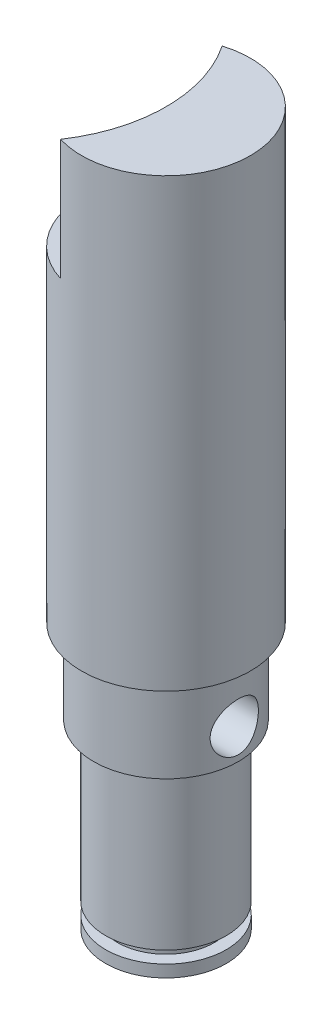
ISO-10303-21;
HEADER;
FILE_DESCRIPTION(('STEP AP214'),'2;1');
FILE_NAME('part.step','',(''),(''),'','','');
FILE_SCHEMA(('AUTOMOTIVE_DESIGN { 1 0 10303 214 1 1 1 1 }'));
ENDSEC;
DATA;
#1=APPLICATION_CONTEXT('core data for automotive mechanical design processes');
#2=APPLICATION_PROTOCOL_DEFINITION('international standard','automotive_design',2000,#1);
#3=PRODUCT_CONTEXT('',#1,'mechanical');
#4=PRODUCT('Part','Part','',(#3));
#5=PRODUCT_RELATED_PRODUCT_CATEGORY('part','',(#4));
#6=PRODUCT_DEFINITION_FORMATION('','',#4);
#7=PRODUCT_DEFINITION_CONTEXT('part definition',#1,'design');
#8=PRODUCT_DEFINITION('design','',#6,#7);
#9=PRODUCT_DEFINITION_SHAPE('','',#8);
#10=(LENGTH_UNIT() NAMED_UNIT(*) SI_UNIT(.MILLI.,.METRE.));
#11=(NAMED_UNIT(*) PLANE_ANGLE_UNIT() SI_UNIT($,.RADIAN.));
#12=(NAMED_UNIT(*) SI_UNIT($,.STERADIAN.) SOLID_ANGLE_UNIT());
#13=UNCERTAINTY_MEASURE_WITH_UNIT(LENGTH_MEASURE(1.E-05),#10,'distance_accuracy_value','');
#14=(GEOMETRIC_REPRESENTATION_CONTEXT(3) GLOBAL_UNCERTAINTY_ASSIGNED_CONTEXT((#13)) GLOBAL_UNIT_ASSIGNED_CONTEXT((#10,
#11,#12)) REPRESENTATION_CONTEXT('',''));
#15=CARTESIAN_POINT('',(0.,0.,0.));
#16=DIRECTION('',(0.,0.,1.));
#17=DIRECTION('',(1.,0.,0.));
#18=AXIS2_PLACEMENT_3D('',#15,#16,#17);
#19=CARTESIAN_POINT('',(0.,0.5,0.));
#20=DIRECTION('',(0.,-1.,0.));
#21=DIRECTION('',(0.,0.,-1.));
#22=AXIS2_PLACEMENT_3D('',#19,#20,#21);
#23=CYLINDRICAL_SURFACE('',#22,2.5);
#24=CARTESIAN_POINT('',(0.,0.5,0.));
#25=DIRECTION('',(0.,1.,0.));
#26=DIRECTION('',(0.,0.,1.));
#27=AXIS2_PLACEMENT_3D('',#24,#25,#26);
#28=CIRCLE('',#27,2.5);
#29=CARTESIAN_POINT('',(0.,0.5,2.5));
#30=VERTEX_POINT('',#29);
#31=EDGE_CURVE('E50',#30,#30,#28,.T.);
#32=ORIENTED_EDGE('',*,*,#31,.F.);
#33=EDGE_LOOP('',(#32));
#34=FACE_BOUND('',#33,.T.);
#35=CARTESIAN_POINT('',(0.,0.,0.));
#36=DIRECTION('',(0.,1.,0.));
#37=DIRECTION('',(0.,0.,1.));
#38=AXIS2_PLACEMENT_3D('',#35,#36,#37);
#39=CIRCLE('',#38,2.5);
#40=CARTESIAN_POINT('',(0.,0.,2.5));
#41=VERTEX_POINT('',#40);
#42=EDGE_CURVE('E103',#41,#41,#39,.T.);
#43=ORIENTED_EDGE('',*,*,#42,.T.);
#44=EDGE_LOOP('',(#43));
#45=FACE_BOUND('',#44,.T.);
#46=ADVANCED_FACE('F37',(#34,#45),#23,.T.);
#47=CARTESIAN_POINT('',(0.,0.5,0.));
#48=DIRECTION('',(0.,1.,0.));
#49=DIRECTION('',(0.,0.,1.));
#50=AXIS2_PLACEMENT_3D('',#47,#48,#49);
#51=PLANE('',#50);
#52=CARTESIAN_POINT('',(0.,0.5,0.));
#53=DIRECTION('',(0.,1.,0.));
#54=DIRECTION('',(0.,0.,1.));
#55=AXIS2_PLACEMENT_3D('',#52,#53,#54);
#56=CIRCLE('',#55,2.);
#57=CARTESIAN_POINT('',(0.,0.5,2.));
#58=VERTEX_POINT('',#57);
#59=EDGE_CURVE('E11',#58,#58,#56,.T.);
#60=ORIENTED_EDGE('',*,*,#59,.F.);
#61=EDGE_LOOP('',(#60));
#62=FACE_BOUND('',#61,.T.);
#63=ORIENTED_EDGE('',*,*,#31,.T.);
#64=EDGE_LOOP('',(#63));
#65=FACE_BOUND('',#64,.T.);
#66=ADVANCED_FACE('F146',(#62,#65),#51,.T.);
#67=CARTESIAN_POINT('',(0.,0.,0.));
#68=DIRECTION('',(0.,1.,0.));
#69=DIRECTION('',(0.,0.,1.));
#70=AXIS2_PLACEMENT_3D('',#67,#68,#69);
#71=PLANE('',#70);
#72=ORIENTED_EDGE('',*,*,#42,.F.);
#73=EDGE_LOOP('',(#72));
#74=FACE_BOUND('',#73,.T.);
#75=ADVANCED_FACE('F151',(#74),#71,.F.);
#76=CARTESIAN_POINT('',(0.,1.,0.));
#77=DIRECTION('',(0.,-1.,0.));
#78=DIRECTION('',(0.,0.,-1.));
#79=AXIS2_PLACEMENT_3D('',#76,#77,#78);
#80=CYLINDRICAL_SURFACE('',#79,2.);
#81=CARTESIAN_POINT('',(0.,1.,0.));
#82=DIRECTION('',(0.,1.,0.));
#83=DIRECTION('',(0.,0.,1.));
#84=AXIS2_PLACEMENT_3D('',#81,#82,#83);
#85=CIRCLE('',#84,2.);
#86=CARTESIAN_POINT('',(0.,1.,2.));
#87=VERTEX_POINT('',#86);
#88=EDGE_CURVE('E99',#87,#87,#85,.T.);
#89=ORIENTED_EDGE('',*,*,#88,.F.);
#90=EDGE_LOOP('',(#89));
#91=FACE_BOUND('',#90,.T.);
#92=ORIENTED_EDGE('',*,*,#59,.T.);
#93=EDGE_LOOP('',(#92));
#94=FACE_BOUND('',#93,.T.);
#95=ADVANCED_FACE('F159',(#91,#94),#80,.T.);
#96=CARTESIAN_POINT('',(0.,7.5,0.));
#97=DIRECTION('',(0.,-1.,0.));
#98=DIRECTION('',(0.,0.,-1.));
#99=AXIS2_PLACEMENT_3D('',#96,#97,#98);
#100=CYLINDRICAL_SURFACE('',#99,2.5);
#101=CARTESIAN_POINT('',(0.,7.5,0.));
#102=DIRECTION('',(0.,1.,0.));
#103=DIRECTION('',(0.,0.,1.));
#104=AXIS2_PLACEMENT_3D('',#101,#102,#103);
#105=CIRCLE('',#104,2.5);
#106=CARTESIAN_POINT('',(0.,7.5,-2.5));
#107=VERTEX_POINT('',#106);
#108=EDGE_CURVE('E96',#107,#107,#105,.T.);
#109=CARTESIAN_POINT('',(0.,1.,0.));
#110=DIRECTION('',(0.,1.,0.));
#111=DIRECTION('',(0.,0.,1.));
#112=AXIS2_PLACEMENT_3D('',#109,#110,#111);
#113=CIRCLE('',#112,2.5);
#114=CARTESIAN_POINT('',(0.,1.,-2.5));
#115=VERTEX_POINT('',#114);
#116=EDGE_CURVE('E94',#115,#115,#113,.T.);
#117=CARTESIAN_POINT('',(0.,7.5,-2.5));
#118=CARTESIAN_POINT('',(0.,7.43229166666667,-2.5));
#119=CARTESIAN_POINT('',(0.,7.36458333333333,-2.5));
#120=CARTESIAN_POINT('',(0.,7.22916666666667,-2.5));
#121=CARTESIAN_POINT('',(0.,7.16145833333333,-2.5));
#122=CARTESIAN_POINT('',(0.,7.02604166666667,-2.5));
#123=CARTESIAN_POINT('',(0.,6.95833333333333,-2.5));
#124=CARTESIAN_POINT('',(0.,6.82291666666667,-2.5));
#125=CARTESIAN_POINT('',(0.,6.75520833333333,-2.5));
#126=CARTESIAN_POINT('',(0.,6.61979166666667,-2.5));
#127=CARTESIAN_POINT('',(0.,6.55208333333333,-2.5));
#128=CARTESIAN_POINT('',(0.,6.41666666666667,-2.5));
#129=CARTESIAN_POINT('',(0.,6.34895833333333,-2.5));
#130=CARTESIAN_POINT('',(0.,6.21354166666667,-2.5));
#131=CARTESIAN_POINT('',(0.,6.14583333333333,-2.5));
#132=CARTESIAN_POINT('',(0.,6.01041666666667,-2.5));
#133=CARTESIAN_POINT('',(0.,5.94270833333333,-2.5));
#134=CARTESIAN_POINT('',(0.,5.80729166666667,-2.5));
#135=CARTESIAN_POINT('',(0.,5.73958333333333,-2.5));
#136=CARTESIAN_POINT('',(0.,5.60416666666667,-2.5));
#137=CARTESIAN_POINT('',(0.,5.53645833333333,-2.5));
#138=CARTESIAN_POINT('',(0.,5.40104166666667,-2.5));
#139=CARTESIAN_POINT('',(0.,5.33333333333333,-2.5));
#140=CARTESIAN_POINT('',(0.,5.19791666666667,-2.5));
#141=CARTESIAN_POINT('',(0.,5.13020833333333,-2.5));
#142=CARTESIAN_POINT('',(0.,4.99479166666667,-2.5));
#143=CARTESIAN_POINT('',(0.,4.92708333333333,-2.5));
#144=CARTESIAN_POINT('',(0.,4.79166666666667,-2.5));
#145=CARTESIAN_POINT('',(0.,4.72395833333333,-2.5));
#146=CARTESIAN_POINT('',(0.,4.58854166666667,-2.5));
#147=CARTESIAN_POINT('',(0.,4.52083333333333,-2.5));
#148=CARTESIAN_POINT('',(0.,4.38541666666667,-2.5));
#149=CARTESIAN_POINT('',(0.,4.31770833333333,-2.5));
#150=CARTESIAN_POINT('',(0.,4.18229166666667,-2.5));
#151=CARTESIAN_POINT('',(0.,4.11458333333333,-2.5));
#152=CARTESIAN_POINT('',(0.,3.97916666666667,-2.5));
#153=CARTESIAN_POINT('',(0.,3.91145833333333,-2.5));
#154=CARTESIAN_POINT('',(0.,3.77604166666667,-2.5));
#155=CARTESIAN_POINT('',(0.,3.70833333333333,-2.5));
#156=CARTESIAN_POINT('',(0.,3.57291666666667,-2.5));
#157=CARTESIAN_POINT('',(0.,3.50520833333333,-2.5));
#158=CARTESIAN_POINT('',(0.,3.36979166666667,-2.5));
#159=CARTESIAN_POINT('',(0.,3.30208333333333,-2.5));
#160=CARTESIAN_POINT('',(0.,3.16666666666667,-2.5));
#161=CARTESIAN_POINT('',(0.,3.09895833333333,-2.5));
#162=CARTESIAN_POINT('',(0.,2.96354166666667,-2.5));
#163=CARTESIAN_POINT('',(0.,2.89583333333333,-2.5));
#164=CARTESIAN_POINT('',(0.,2.76041666666667,-2.5));
#165=CARTESIAN_POINT('',(0.,2.69270833333333,-2.5));
#166=CARTESIAN_POINT('',(0.,2.55729166666667,-2.5));
#167=CARTESIAN_POINT('',(0.,2.48958333333333,-2.5));
#168=CARTESIAN_POINT('',(0.,2.35416666666667,-2.5));
#169=CARTESIAN_POINT('',(0.,2.28645833333333,-2.5));
#170=CARTESIAN_POINT('',(0.,2.15104166666667,-2.5));
#171=CARTESIAN_POINT('',(0.,2.08333333333333,-2.5));
#172=CARTESIAN_POINT('',(0.,1.94791666666667,-2.5));
#173=CARTESIAN_POINT('',(0.,1.88020833333333,-2.5));
#174=CARTESIAN_POINT('',(0.,1.74479166666667,-2.5));
#175=CARTESIAN_POINT('',(0.,1.67708333333333,-2.5));
#176=CARTESIAN_POINT('',(0.,1.54166666666667,-2.5));
#177=CARTESIAN_POINT('',(0.,1.47395833333333,-2.5));
#178=CARTESIAN_POINT('',(0.,1.33854166666667,-2.5));
#179=CARTESIAN_POINT('',(0.,1.27083333333333,-2.5));
#180=CARTESIAN_POINT('',(0.,1.13541666666667,-2.5));
#181=CARTESIAN_POINT('',(0.,1.06770833333333,-2.5));
#182=CARTESIAN_POINT('',(0.,1.,-2.5));
#183=B_SPLINE_CURVE_WITH_KNOTS('',3,(#117,#118,#119,#120,#121,#122,#123,#124,#125,#126,#127,
#128,#129,#130,#131,#132,#133,#134,#135,#136,#137,#138,#139,#140,#141,#142,#143,#144,#145,#146,
#147,#148,#149,#150,#151,#152,#153,#154,#155,#156,#157,#158,#159,#160,#161,#162,#163,#164,#165,
#166,#167,#168,#169,#170,#171,#172,#173,#174,#175,#176,#177,#178,#179,#180,#181,#182),
.UNSPECIFIED.,.F.,.F.,(4,2,2,2,2,2,2,2,2,2,2,2,2,2,2,2,2,2,2,2,2,2,2,2,2,2,2,2,2,2,2,2,4),(0.,
0.203124999999999,0.40625,0.609375,0.8125,1.015625,1.21875,1.421875,1.625,1.828125,2.03125,
2.234375,2.4375,2.640625,2.84375,3.046875,3.25,3.453125,3.65625,3.859375,4.0625,4.265625,
4.46875,4.671875,4.875,5.078125,5.28125,5.484375,5.6875,5.890625,6.09375,6.296875,6.5),.UNSPECIFIED.);
#184=EDGE_CURVE('BSEAM163',#107,#115,#183,.T.);
#185=ORIENTED_EDGE('',*,*,#108,.F.);
#186=ORIENTED_EDGE('',*,*,#116,.T.);
#187=ORIENTED_EDGE('',*,*,#184,.T.);
#188=ORIENTED_EDGE('',*,*,#184,.F.);
#189=EDGE_LOOP('',(#185,#187,#186,#188));
#190=FACE_BOUND('',#189,.T.);
#191=ADVANCED_FACE('F163',(#190),#100,.T.);
#192=CARTESIAN_POINT('',(0.,1.,0.));
#193=DIRECTION('',(0.,1.,0.));
#194=DIRECTION('',(0.,0.,1.));
#195=AXIS2_PLACEMENT_3D('',#192,#193,#194);
#196=PLANE('',#195);
#197=ORIENTED_EDGE('',*,*,#88,.T.);
#198=EDGE_LOOP('',(#197));
#199=FACE_BOUND('',#198,.T.);
#200=ORIENTED_EDGE('',*,*,#116,.F.);
#201=EDGE_LOOP('',(#200));
#202=FACE_BOUND('',#201,.T.);
#203=ADVANCED_FACE('F142',(#199,#202),#196,.F.);
#204=CARTESIAN_POINT('',(0.,11.,0.));
#205=DIRECTION('',(0.,-1.,0.));
#206=DIRECTION('',(0.,0.,-1.));
#207=AXIS2_PLACEMENT_3D('',#204,#205,#206);
#208=CYLINDRICAL_SURFACE('',#207,3.);
#209=CARTESIAN_POINT('',(-2.82842712474619,8.75,-1.));
#210=CARTESIAN_POINT('',(-2.82842694532735,8.80446817481068,-1.0000002579478));
#211=CARTESIAN_POINT('',(-2.83001769372806,8.85893479977152,-0.99553478369814));
#212=CARTESIAN_POINT('',(-2.8361757417458,8.96625442095061,-0.977851131702564));
#213=CARTESIAN_POINT('',(-2.8407435316722,9.01910714986394,-0.964631512170673));
#214=CARTESIAN_POINT('',(-2.85228203663888,9.12162689301281,-0.929955485680263));
#215=CARTESIAN_POINT('',(-2.8592480396464,9.17129992944688,-0.908515221402001));
#216=CARTESIAN_POINT('',(-2.87479122017008,9.26636004854379,-0.858061628442628));
#217=CARTESIAN_POINT('',(-2.88336875305432,9.3117461825525,-0.829046628860523));
#218=CARTESIAN_POINT('',(-2.90154489405589,9.39871996233949,-0.763051146442527));
#219=CARTESIAN_POINT('',(-2.91116894844139,9.44011542867204,-0.725824341377825));
#220=CARTESIAN_POINT('',(-2.93013864801508,9.51620680122432,-0.64498766721449));
#221=CARTESIAN_POINT('',(-2.93948424829099,9.55090163158228,-0.601376775052403));
#222=CARTESIAN_POINT('',(-2.95713866921658,9.61347889732968,-0.507604507964985));
#223=CARTESIAN_POINT('',(-2.96541407701568,9.64115997061798,-0.457301911224519));
#224=CARTESIAN_POINT('',(-2.9796958677102,9.68759158512749,-0.352431222987482));
#225=CARTESIAN_POINT('',(-2.98570286203012,9.7063445331769,-0.297864285687215));
#226=CARTESIAN_POINT('',(-2.99459075431897,9.7337358546324,-0.188028817433493));
#227=CARTESIAN_POINT('',(-2.99757314777558,9.74270344625701,-0.132850754852968));
#228=CARTESIAN_POINT('',(-3.00043608218249,9.75131629336066,-0.0216978748240917));
#229=CARTESIAN_POINT('',(-3.00031742262891,9.75096395165242,0.034276733543892));
#230=CARTESIAN_POINT('',(-2.99706039618736,9.74115574543397,0.143103515193816));
#231=CARTESIAN_POINT('',(-2.99404064755135,9.73205747152549,0.195992048591666));
#232=CARTESIAN_POINT('',(-2.98546967339714,9.70560701901955,0.29944343882216));
#233=CARTESIAN_POINT('',(-2.97991827631115,9.68825428102024,0.350006137779175));
#234=CARTESIAN_POINT('',(-2.96675670293292,9.64557868269387,0.448152474842013));
#235=CARTESIAN_POINT('',(-2.9591204252427,9.62015406145322,0.495688220968998));
#236=CARTESIAN_POINT('',(-2.94258393038665,9.56214029455161,0.585924325527169));
#237=CARTESIAN_POINT('',(-2.93368336200518,9.52954915667336,0.628623334384769));
#238=CARTESIAN_POINT('',(-2.9150619185089,9.45632560653926,0.710100866551907));
#239=CARTESIAN_POINT('',(-2.90532215172667,9.41538684215456,0.748600157067556));
#240=CARTESIAN_POINT('',(-2.88647335245111,9.32755127427734,0.81827725959589));
#241=CARTESIAN_POINT('',(-2.8773644173145,9.28065355428676,0.849453943273005));
#242=CARTESIAN_POINT('',(-2.86070525135531,9.18134637438458,0.903987455042732));
#243=CARTESIAN_POINT('',(-2.85317909338821,9.12886786863219,0.927226463651049));
#244=CARTESIAN_POINT('',(-2.84081650878299,9.02042860573374,0.964443193299506));
#245=CARTESIAN_POINT('',(-2.83597895501223,8.96446931877818,0.978424795755529));
#246=CARTESIAN_POINT('',(-2.8297963630207,8.85336164459938,0.996161282090474));
#247=CARTESIAN_POINT('',(-2.82830360315139,8.79829057525427,1.00034909550575));
#248=CARTESIAN_POINT('',(-2.828566720628,8.68822385088296,0.999605438911605));
#249=CARTESIAN_POINT('',(-2.83032200792768,8.63322818397524,0.99467562522726));
#250=CARTESIAN_POINT('',(-2.83673618089379,8.52684303428883,0.97622565155183));
#251=CARTESIAN_POINT('',(-2.84129325440593,8.47539456984936,0.963006393980555));
#252=CARTESIAN_POINT('',(-2.8526855367127,8.37545639376062,0.928713862560597));
#253=CARTESIAN_POINT('',(-2.85952114934907,8.32696720840917,0.907639196363458));
#254=CARTESIAN_POINT('',(-2.87496877595718,8.23261957915306,0.857474340738902));
#255=CARTESIAN_POINT('',(-2.8836302566561,8.18689335735822,0.828151118358489));
#256=CARTESIAN_POINT('',(-2.90165768730984,8.10085394761627,0.76258563055757));
#257=CARTESIAN_POINT('',(-2.91102384443799,8.06054236133878,0.726341325498786));
#258=CARTESIAN_POINT('',(-2.92995038637844,7.98447201590937,0.645891705900324));
#259=CARTESIAN_POINT('',(-2.93949843577895,7.94902560998115,0.601387270546652));
#260=CARTESIAN_POINT('',(-2.9572685161311,7.88608385765195,0.506827291400258));
#261=CARTESIAN_POINT('',(-2.96549059417695,7.85858822883758,0.456771944864553));
#262=CARTESIAN_POINT('',(-2.97964405810603,7.81257989513828,0.352779862432296));
#263=CARTESIAN_POINT('',(-2.98559030004531,7.79400872285193,0.298871123321198));
#264=CARTESIAN_POINT('',(-2.99458610837774,7.76627225793989,0.188458465846018));
#265=CARTESIAN_POINT('',(-2.99763672034018,7.7571035701195,0.131955491953891));
#266=CARTESIAN_POINT('',(-3.00041863236257,7.74873792239436,0.0208153358600415));
#267=CARTESIAN_POINT('',(-3.00029920089441,7.74909254606762,-0.0337847239200182));
#268=CARTESIAN_POINT('',(-2.99712196519396,7.75865730814641,-0.142111145000173));
#269=CARTESIAN_POINT('',(-2.99406439933567,7.76786672815276,-0.195837576819055));
#270=CARTESIAN_POINT('',(-2.98540914954421,7.79458223457597,-0.30004211943206));
#271=CARTESIAN_POINT('',(-2.9798525836118,7.81195421535295,-0.350558270912794));
#272=CARTESIAN_POINT('',(-2.96677160704464,7.85437753109713,-0.447978350939788));
#273=CARTESIAN_POINT('',(-2.95924684047901,7.87943025519694,-0.494881624142409));
#274=CARTESIAN_POINT('',(-2.94265868828001,7.93756951210208,-0.585634016308809));
#275=CARTESIAN_POINT('',(-2.93354872492381,7.97091868538192,-0.629306251557696));
#276=CARTESIAN_POINT('',(-2.91492988791425,8.04425739115591,-0.710581026272338));
#277=CARTESIAN_POINT('',(-2.90542088771397,8.08424904226168,-0.748181621624259));
#278=CARTESIAN_POINT('',(-2.88663279827365,8.17160935558803,-0.817741808833464));
#279=CARTESIAN_POINT('',(-2.87737727995345,8.21920551098077,-0.849422965999218));
#280=CARTESIAN_POINT('',(-2.86060193316303,8.31933442689865,-0.9043143432998));
#281=CARTESIAN_POINT('',(-2.8530816513617,8.37186589301425,-0.927526776814559));
#282=CARTESIAN_POINT('',(-2.84101334230535,8.47796182402383,-0.963843828206627));
#283=CARTESIAN_POINT('',(-2.83634632944799,8.53137226356572,-0.977357909163268));
#284=CARTESIAN_POINT('',(-2.83005383613939,8.63985605051547,-0.995434320161694));
#285=CARTESIAN_POINT('',(-2.82842730615135,8.69492881743575,-0.999999739196502));
#286=CARTESIAN_POINT('',(-2.82842712474619,8.75,-1.));
#287=B_SPLINE_CURVE_WITH_KNOTS('',3,(#209,#210,#211,#212,#213,#214,#215,#216,#217,#218,#219,
#220,#221,#222,#223,#224,#225,#226,#227,#228,#229,#230,#231,#232,#233,#234,#235,#236,#237,#238,
#239,#240,#241,#242,#243,#244,#245,#246,#247,#248,#249,#250,#251,#252,#253,#254,#255,#256,#257,
#258,#259,#260,#261,#262,#263,#264,#265,#266,#267,#268,#269,#270,#271,#272,#273,#274,#275,#276,
#277,#278,#279,#280,#281,#282,#283,#284,#285,#286),.UNSPECIFIED.,.T.,.F.,(4,2,2,2,2,2,2,2,2,2,2,
2,2,2,2,2,2,2,2,2,2,2,2,2,2,2,2,2,2,2,2,2,2,2,2,2,2,2,4),(0.,0.163200584775417,0.32642805496888,
0.489336627454543,0.652281166139158,0.821013374229398,0.989772651673595,1.16293506139029,
1.33605076382161,1.50314318760306,1.67019253297699,1.83069004820941,1.99119844184608,
2.15381654855707,2.31647991869394,2.48680174359289,2.65714979607478,2.82992639837376,
3.00263051349688,3.16754291357512,3.33242535830307,3.49164395761849,3.65089079140018,
3.81518857728788,3.979534856552,4.15178808164165,4.32403518750605,4.49513791183924,
4.66617882997229,4.82918084670708,4.99216964002854,5.15256956033503,5.31299850756315,
5.47935519513707,5.64576504425704,5.81868902729218,5.9915677825994,6.15663212153686,
6.32163947179229),.UNSPECIFIED.);
#288=CARTESIAN_POINT('',(-2.82842712474619,8.75,-1.));
#289=VERTEX_POINT('',#288);
#290=EDGE_CURVE('E40',#289,#289,#287,.T.);
#291=ORIENTED_EDGE('',*,*,#290,.T.);
#292=EDGE_LOOP('',(#291));
#293=FACE_BOUND('',#292,.T.);
#294=CARTESIAN_POINT('',(2.82842712474619,8.75,-1.));
#295=CARTESIAN_POINT('',(2.82842694532735,8.69553182518932,-1.0000002579478));
#296=CARTESIAN_POINT('',(2.83001769372806,8.64106520022847,-0.99553478369814));
#297=CARTESIAN_POINT('',(2.8361757417458,8.53374557904938,-0.977851131702564));
#298=CARTESIAN_POINT('',(2.8407435316722,8.48089285013606,-0.964631512170673));
#299=CARTESIAN_POINT('',(2.85228203663888,8.37837310698719,-0.929955485680263));
#300=CARTESIAN_POINT('',(2.8592480396464,8.32870007055312,-0.908515221402001));
#301=CARTESIAN_POINT('',(2.87479122017008,8.2336399514562,-0.858061628442628));
#302=CARTESIAN_POINT('',(2.88336875305432,8.1882538174475,-0.829046628860523));
#303=CARTESIAN_POINT('',(2.90154489405589,8.10128003766051,-0.763051146442527));
#304=CARTESIAN_POINT('',(2.91116894844139,8.05988457132796,-0.725824341377825));
#305=CARTESIAN_POINT('',(2.93013864801508,7.98379319877568,-0.64498766721449));
#306=CARTESIAN_POINT('',(2.93948424829099,7.94909836841771,-0.601376775052403));
#307=CARTESIAN_POINT('',(2.95713866921658,7.88652110267032,-0.507604507964985));
#308=CARTESIAN_POINT('',(2.96541407701568,7.85884002938202,-0.45730191122452));
#309=CARTESIAN_POINT('',(2.9796958677102,7.81240841487251,-0.352431222987482));
#310=CARTESIAN_POINT('',(2.98570286203012,7.7936554668231,-0.297864285687215));
#311=CARTESIAN_POINT('',(2.99459075431897,7.7662641453676,-0.188028817433494));
#312=CARTESIAN_POINT('',(2.99757314777558,7.75729655374299,-0.132850754852968));
#313=CARTESIAN_POINT('',(3.00043608218249,7.74868370663934,-0.0216978748240919));
#314=CARTESIAN_POINT('',(3.00031742262891,7.74903604834758,0.0342767335438922));
#315=CARTESIAN_POINT('',(2.99706039618736,7.75884425456603,0.143103515193817));
#316=CARTESIAN_POINT('',(2.99404064755135,7.76794252847451,0.195992048591667));
#317=CARTESIAN_POINT('',(2.98546967339714,7.79439298098045,0.29944343882216));
#318=CARTESIAN_POINT('',(2.97991827631115,7.81174571897975,0.350006137779175));
#319=CARTESIAN_POINT('',(2.96675670293292,7.85442131730613,0.448152474842013));
#320=CARTESIAN_POINT('',(2.9591204252427,7.87984593854678,0.495688220968998));
#321=CARTESIAN_POINT('',(2.94258393038665,7.93785970544839,0.585924325527169));
#322=CARTESIAN_POINT('',(2.93368336200518,7.97045084332664,0.628623334384769));
#323=CARTESIAN_POINT('',(2.9150619185089,8.04367439346074,0.710100866551907));
#324=CARTESIAN_POINT('',(2.90532215172667,8.08461315784544,0.748600157067556));
#325=CARTESIAN_POINT('',(2.88647335245111,8.17244872572266,0.818277259595889));
#326=CARTESIAN_POINT('',(2.8773644173145,8.21934644571324,0.849453943273005));
#327=CARTESIAN_POINT('',(2.86070525135531,8.31865362561541,0.903987455042732));
#328=CARTESIAN_POINT('',(2.85317909338821,8.37113213136781,0.927226463651049));
#329=CARTESIAN_POINT('',(2.84081650878299,8.47957139426626,0.964443193299506));
#330=CARTESIAN_POINT('',(2.83597895501223,8.53553068122182,0.978424795755529));
#331=CARTESIAN_POINT('',(2.8297963630207,8.64663835540062,0.996161282090474));
#332=CARTESIAN_POINT('',(2.82830360315139,8.70170942474572,1.00034909550575));
#333=CARTESIAN_POINT('',(2.828566720628,8.81177614911704,0.999605438911605));
#334=CARTESIAN_POINT('',(2.83032200792768,8.86677181602476,0.99467562522726));
#335=CARTESIAN_POINT('',(2.83673618089379,8.97315696571116,0.97622565155183));
#336=CARTESIAN_POINT('',(2.84129325440593,9.02460543015064,0.963006393980555));
#337=CARTESIAN_POINT('',(2.8526855367127,9.12454360623938,0.928713862560597));
#338=CARTESIAN_POINT('',(2.85952114934907,9.17303279159083,0.907639196363458));
#339=CARTESIAN_POINT('',(2.87496877595718,9.26738042084694,0.857474340738902));
#340=CARTESIAN_POINT('',(2.8836302566561,9.31310664264178,0.828151118358489));
#341=CARTESIAN_POINT('',(2.90165768730984,9.39914605238373,0.76258563055757));
#342=CARTESIAN_POINT('',(2.91102384443799,9.43945763866122,0.726341325498786));
#343=CARTESIAN_POINT('',(2.92995038637844,9.51552798409063,0.645891705900324));
#344=CARTESIAN_POINT('',(2.93949843577895,9.55097439001885,0.601387270546652));
#345=CARTESIAN_POINT('',(2.9572685161311,9.61391614234804,0.506827291400258));
#346=CARTESIAN_POINT('',(2.96549059417695,9.64141177116242,0.456771944864553));
#347=CARTESIAN_POINT('',(2.97964405810603,9.68742010486171,0.352779862432296));
#348=CARTESIAN_POINT('',(2.98559030004531,9.70599127714806,0.298871123321197));
#349=CARTESIAN_POINT('',(2.99458610837774,9.7337277420601,0.188458465846017));
#350=CARTESIAN_POINT('',(2.99763672034018,9.7428964298805,0.131955491953891));
#351=CARTESIAN_POINT('',(3.00041863236257,9.75126207760564,0.0208153358600418));
#352=CARTESIAN_POINT('',(3.00029920089441,9.75090745393238,-0.0337847239200182));
#353=CARTESIAN_POINT('',(2.99712196519396,9.74134269185359,-0.142111145000173));
#354=CARTESIAN_POINT('',(2.99406439933567,9.73213327184723,-0.195837576819054));
#355=CARTESIAN_POINT('',(2.98540914954421,9.70541776542403,-0.30004211943206));
#356=CARTESIAN_POINT('',(2.9798525836118,9.68804578464705,-0.350558270912794));
#357=CARTESIAN_POINT('',(2.96677160704464,9.64562246890286,-0.447978350939789));
#358=CARTESIAN_POINT('',(2.95924684047901,9.62056974480306,-0.494881624142409));
#359=CARTESIAN_POINT('',(2.94265868828001,9.56243048789792,-0.585634016308809));
#360=CARTESIAN_POINT('',(2.93354872492381,9.52908131461808,-0.629306251557696));
#361=CARTESIAN_POINT('',(2.91492988791425,9.45574260884408,-0.710581026272338));
#362=CARTESIAN_POINT('',(2.90542088771397,9.41575095773832,-0.748181621624259));
#363=CARTESIAN_POINT('',(2.88663279827365,9.32839064441196,-0.817741808833464));
#364=CARTESIAN_POINT('',(2.87737727995345,9.28079448901923,-0.849422965999217));
#365=CARTESIAN_POINT('',(2.86060193316303,9.18066557310135,-0.9043143432998));
#366=CARTESIAN_POINT('',(2.8530816513617,9.12813410698575,-0.927526776814559));
#367=CARTESIAN_POINT('',(2.84101334230535,9.02203817597617,-0.963843828206626));
#368=CARTESIAN_POINT('',(2.83634632944799,8.96862773643428,-0.977357909163268));
#369=CARTESIAN_POINT('',(2.83005383613939,8.86014394948452,-0.995434320161694));
#370=CARTESIAN_POINT('',(2.82842730615135,8.80507118256425,-0.999999739196502));
#371=CARTESIAN_POINT('',(2.82842712474619,8.75,-1.));
#372=B_SPLINE_CURVE_WITH_KNOTS('',3,(#294,#295,#296,#297,#298,#299,#300,#301,#302,#303,#304,
#305,#306,#307,#308,#309,#310,#311,#312,#313,#314,#315,#316,#317,#318,#319,#320,#321,#322,#323,
#324,#325,#326,#327,#328,#329,#330,#331,#332,#333,#334,#335,#336,#337,#338,#339,#340,#341,#342,
#343,#344,#345,#346,#347,#348,#349,#350,#351,#352,#353,#354,#355,#356,#357,#358,#359,#360,#361,
#362,#363,#364,#365,#366,#367,#368,#369,#370,#371),.UNSPECIFIED.,.T.,.F.,(4,2,2,2,2,2,2,2,2,2,2,
2,2,2,2,2,2,2,2,2,2,2,2,2,2,2,2,2,2,2,2,2,2,2,2,2,2,2,4),(0.,0.163200584775417,0.32642805496888,
0.489336627454543,0.652281166139158,0.821013374229398,0.989772651673595,1.16293506139029,
1.33605076382161,1.50314318760306,1.67019253297699,1.83069004820941,1.99119844184608,
2.15381654855707,2.31647991869394,2.48680174359289,2.65714979607478,2.82992639837376,
3.00263051349688,3.16754291357512,3.33242535830307,3.49164395761849,3.65089079140018,
3.81518857728788,3.979534856552,4.15178808164165,4.32403518750605,4.49513791183924,
4.66617882997229,4.82918084670708,4.99216964002854,5.15256956033503,5.31299850756315,
5.47935519513707,5.64576504425705,5.81868902729218,5.9915677825994,6.15663212153686,
6.3216394717923),.UNSPECIFIED.);
#373=CARTESIAN_POINT('',(2.82842712474619,8.75,-1.));
#374=VERTEX_POINT('',#373);
#375=EDGE_CURVE('E108',#374,#374,#372,.T.);
#376=ORIENTED_EDGE('',*,*,#375,.T.);
#377=EDGE_LOOP('',(#376));
#378=FACE_BOUND('',#377,.T.);
#379=CARTESIAN_POINT('',(0.,11.,0.));
#380=DIRECTION('',(0.,1.,0.));
#381=DIRECTION('',(0.,0.,1.));
#382=AXIS2_PLACEMENT_3D('',#379,#380,#381);
#383=CIRCLE('',#382,3.);
#384=CARTESIAN_POINT('',(0.,11.,3.));
#385=VERTEX_POINT('',#384);
#386=EDGE_CURVE('E87',#385,#385,#383,.T.);
#387=ORIENTED_EDGE('',*,*,#386,.F.);
#388=EDGE_LOOP('',(#387));
#389=FACE_BOUND('',#388,.T.);
#390=CARTESIAN_POINT('',(0.,7.5,0.));
#391=DIRECTION('',(0.,1.,0.));
#392=DIRECTION('',(0.,0.,1.));
#393=AXIS2_PLACEMENT_3D('',#390,#391,#392);
#394=CIRCLE('',#393,3.);
#395=CARTESIAN_POINT('',(0.,7.5,3.));
#396=VERTEX_POINT('',#395);
#397=EDGE_CURVE('E84',#396,#396,#394,.T.);
#398=ORIENTED_EDGE('',*,*,#397,.T.);
#399=EDGE_LOOP('',(#398));
#400=FACE_BOUND('',#399,.T.);
#401=ADVANCED_FACE('F113',(#293,#378,#389,#400),#208,.T.);
#402=CARTESIAN_POINT('',(0.,7.5,0.));
#403=DIRECTION('',(0.,1.,0.));
#404=DIRECTION('',(0.,0.,1.));
#405=AXIS2_PLACEMENT_3D('',#402,#403,#404);
#406=PLANE('',#405);
#407=ORIENTED_EDGE('',*,*,#108,.T.);
#408=EDGE_LOOP('',(#407));
#409=FACE_BOUND('',#408,.T.);
#410=ORIENTED_EDGE('',*,*,#397,.F.);
#411=EDGE_LOOP('',(#410));
#412=FACE_BOUND('',#411,.T.);
#413=ADVANCED_FACE('F136',(#409,#412),#406,.F.);
#414=CARTESIAN_POINT('',(0.,29.5,0.));
#415=DIRECTION('',(0.,-1.,0.));
#416=DIRECTION('',(0.,0.,-1.));
#417=AXIS2_PLACEMENT_3D('',#414,#415,#416);
#418=CYLINDRICAL_SURFACE('',#417,3.5);
#419=CARTESIAN_POINT('',(0.,24.5,0.));
#420=DIRECTION('',(0.,1.,0.));
#421=DIRECTION('',(0.,0.,1.));
#422=AXIS2_PLACEMENT_3D('',#419,#420,#421);
#423=CIRCLE('',#422,3.5);
#424=CARTESIAN_POINT('',(-1.02083333333333,24.5,-3.34782008261429));
#425=VERTEX_POINT('',#424);
#426=CARTESIAN_POINT('',(-1.02083333333333,24.5,3.34782008261429));
#427=VERTEX_POINT('',#426);
#428=EDGE_CURVE('E74',#425,#427,#423,.T.);
#429=ORIENTED_EDGE('',*,*,#428,.F.);
#430=DIRECTION('',(0.,1.,0.));
#431=VECTOR('',#430,1.);
#432=CARTESIAN_POINT('',(-1.02083333333333,24.5,-3.34782008261429));
#433=LINE('',#432,#431);
#434=CARTESIAN_POINT('',(-1.02083333333333,29.5,-3.34782008261429));
#435=VERTEX_POINT('',#434);
#436=EDGE_CURVE('E64',#425,#435,#433,.T.);
#437=ORIENTED_EDGE('',*,*,#436,.T.);
#438=CARTESIAN_POINT('',(0.,29.5,0.));
#439=DIRECTION('',(0.,1.,0.));
#440=DIRECTION('',(0.,0.,1.));
#441=AXIS2_PLACEMENT_3D('',#438,#439,#440);
#442=CIRCLE('',#441,3.5);
#443=CARTESIAN_POINT('',(-1.02083333333333,29.5,3.34782008261429));
#444=VERTEX_POINT('',#443);
#445=EDGE_CURVE('E80',#444,#435,#442,.T.);
#446=ORIENTED_EDGE('',*,*,#445,.F.);
#447=DIRECTION('',(0.,1.,0.));
#448=VECTOR('',#447,1.);
#449=CARTESIAN_POINT('',(-1.02083333333333,24.5,3.34782008261429));
#450=LINE('',#449,#448);
#451=EDGE_CURVE('E58',#427,#444,#450,.T.);
#452=ORIENTED_EDGE('',*,*,#451,.F.);
#453=EDGE_LOOP('',(#429,#437,#446,#452));
#454=FACE_BOUND('',#453,.T.);
#455=CARTESIAN_POINT('',(0.,11.,0.));
#456=DIRECTION('',(0.,1.,0.));
#457=DIRECTION('',(0.,0.,1.));
#458=AXIS2_PLACEMENT_3D('',#455,#456,#457);
#459=CIRCLE('',#458,3.5);
#460=CARTESIAN_POINT('',(0.,11.,3.5));
#461=VERTEX_POINT('',#460);
#462=EDGE_CURVE('E81',#461,#461,#459,.T.);
#463=ORIENTED_EDGE('',*,*,#462,.T.);
#464=EDGE_LOOP('',(#463));
#465=FACE_BOUND('',#464,.T.);
#466=ADVANCED_FACE('F78',(#454,#465),#418,.T.);
#467=CARTESIAN_POINT('',(0.,29.5,0.));
#468=DIRECTION('',(0.,1.,0.));
#469=DIRECTION('',(0.,0.,1.));
#470=AXIS2_PLACEMENT_3D('',#467,#468,#469);
#471=PLANE('',#470);
#472=CARTESIAN_POINT('',(-6.,29.5,0.));
#473=DIRECTION('',(0.,1.,0.));
#474=DIRECTION('',(0.,0.,1.));
#475=AXIS2_PLACEMENT_3D('',#472,#473,#474);
#476=CIRCLE('',#475,6.);
#477=EDGE_CURVE('E69',#444,#435,#476,.T.);
#478=ORIENTED_EDGE('',*,*,#477,.F.);
#479=ORIENTED_EDGE('',*,*,#445,.T.);
#480=EDGE_LOOP('',(#478,#479));
#481=FACE_BOUND('',#480,.T.);
#482=ADVANCED_FACE('F83',(#481),#471,.T.);
#483=CARTESIAN_POINT('',(0.,11.,0.));
#484=DIRECTION('',(0.,1.,0.));
#485=DIRECTION('',(0.,0.,1.));
#486=AXIS2_PLACEMENT_3D('',#483,#484,#485);
#487=PLANE('',#486);
#488=ORIENTED_EDGE('',*,*,#386,.T.);
#489=EDGE_LOOP('',(#488));
#490=FACE_BOUND('',#489,.T.);
#491=ORIENTED_EDGE('',*,*,#462,.F.);
#492=EDGE_LOOP('',(#491));
#493=FACE_BOUND('',#492,.T.);
#494=ADVANCED_FACE('F129',(#490,#493),#487,.F.);
#495=CARTESIAN_POINT('',(-6.,24.5,0.));
#496=DIRECTION('',(0.,1.,0.));
#497=DIRECTION('',(0.,0.,1.));
#498=AXIS2_PLACEMENT_3D('',#495,#496,#497);
#499=CYLINDRICAL_SURFACE('',#498,6.);
#500=ORIENTED_EDGE('',*,*,#477,.T.);
#501=ORIENTED_EDGE('',*,*,#436,.F.);
#502=CARTESIAN_POINT('',(-6.,24.5,0.));
#503=DIRECTION('',(0.,1.,0.));
#504=DIRECTION('',(0.,0.,1.));
#505=AXIS2_PLACEMENT_3D('',#502,#503,#504);
#506=CIRCLE('',#505,6.);
#507=EDGE_CURVE('E296',#427,#425,#506,.T.);
#508=ORIENTED_EDGE('',*,*,#507,.F.);
#509=ORIENTED_EDGE('',*,*,#451,.T.);
#510=EDGE_LOOP('',(#500,#501,#508,#509));
#511=FACE_BOUND('',#510,.T.);
#512=ADVANCED_FACE('F70',(#511),#499,.F.);
#513=CARTESIAN_POINT('',(-3.,24.5,0.));
#514=DIRECTION('',(0.,1.,0.));
#515=DIRECTION('',(0.,0.,1.));
#516=AXIS2_PLACEMENT_3D('',#513,#514,#515);
#517=PLANE('',#516);
#518=ORIENTED_EDGE('',*,*,#428,.T.);
#519=ORIENTED_EDGE('',*,*,#507,.T.);
#520=EDGE_LOOP('',(#518,#519));
#521=FACE_BOUND('',#520,.T.);
#522=ADVANCED_FACE('F121',(#521),#517,.T.);
#523=CARTESIAN_POINT('',(-3.5,8.75,0.));
#524=DIRECTION('',(1.,0.,0.));
#525=DIRECTION('',(0.,0.,-1.));
#526=AXIS2_PLACEMENT_3D('',#523,#524,#525);
#527=CYLINDRICAL_SURFACE('',#526,1.);
#528=ORIENTED_EDGE('',*,*,#375,.F.);
#529=EDGE_LOOP('',(#528));
#530=FACE_BOUND('',#529,.T.);
#531=ORIENTED_EDGE('',*,*,#290,.F.);
#532=EDGE_LOOP('',(#531));
#533=FACE_BOUND('',#532,.T.);
#534=ADVANCED_FACE('F117',(#530,#533),#527,.F.);
#535=CLOSED_SHELL('',(#46,#66,#75,#95,#191,#203,#401,#413,#466,#482,#494,#512,#522,#534));
#536=MANIFOLD_SOLID_BREP('B2',#535);
#537=ADVANCED_BREP_SHAPE_REPRESENTATION('',(#18,#536),#14);
#538=SHAPE_DEFINITION_REPRESENTATION(#9,#537);
ENDSEC;
END-ISO-10303-21;
